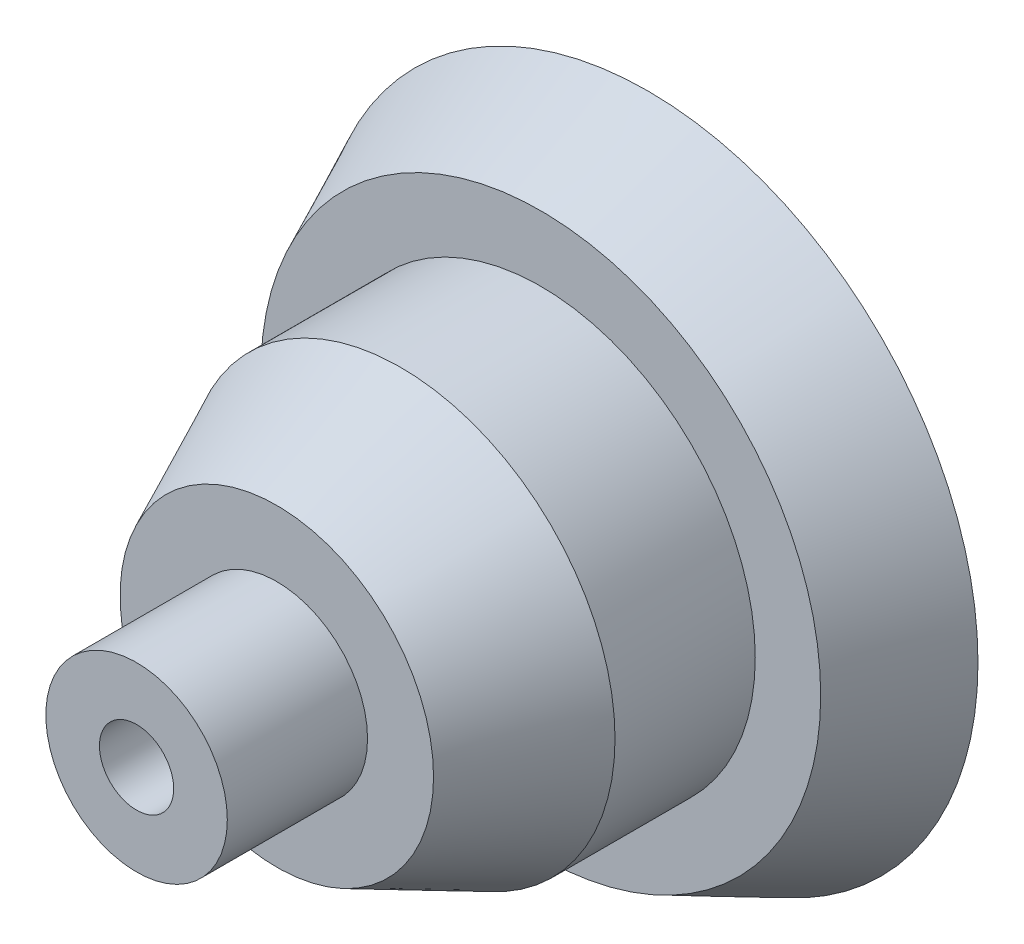
ISO-10303-21;
HEADER;
FILE_DESCRIPTION(('STEP AP214'),'2;1');
FILE_NAME('part.step','',(''),(''),'','','');
FILE_SCHEMA(('AUTOMOTIVE_DESIGN { 1 0 10303 214 1 1 1 1 }'));
ENDSEC;
DATA;
#1=APPLICATION_CONTEXT('core data for automotive mechanical design processes');
#2=APPLICATION_PROTOCOL_DEFINITION('international standard','automotive_design',2000,#1);
#3=PRODUCT_CONTEXT('',#1,'mechanical');
#4=PRODUCT('Part','Part','',(#3));
#5=PRODUCT_RELATED_PRODUCT_CATEGORY('part','',(#4));
#6=PRODUCT_DEFINITION_FORMATION('','',#4);
#7=PRODUCT_DEFINITION_CONTEXT('part definition',#1,'design');
#8=PRODUCT_DEFINITION('design','',#6,#7);
#9=PRODUCT_DEFINITION_SHAPE('','',#8);
#10=(LENGTH_UNIT() NAMED_UNIT(*) SI_UNIT(.MILLI.,.METRE.));
#11=(NAMED_UNIT(*) PLANE_ANGLE_UNIT() SI_UNIT($,.RADIAN.));
#12=(NAMED_UNIT(*) SI_UNIT($,.STERADIAN.) SOLID_ANGLE_UNIT());
#13=UNCERTAINTY_MEASURE_WITH_UNIT(LENGTH_MEASURE(1.E-05),#10,'distance_accuracy_value','');
#14=(GEOMETRIC_REPRESENTATION_CONTEXT(3) GLOBAL_UNCERTAINTY_ASSIGNED_CONTEXT((#13)) GLOBAL_UNIT_ASSIGNED_CONTEXT((#10,
#11,#12)) REPRESENTATION_CONTEXT('',''));
#15=CARTESIAN_POINT('',(0.,0.,0.));
#16=DIRECTION('',(0.,0.,1.));
#17=DIRECTION('',(1.,0.,0.));
#18=AXIS2_PLACEMENT_3D('',#15,#16,#17);
#19=CARTESIAN_POINT('',(0.,0.,50.));
#20=DIRECTION('',(0.,0.,1.));
#21=DIRECTION('',(1.,0.,0.));
#22=AXIS2_PLACEMENT_3D('',#19,#20,#21);
#23=CYLINDRICAL_SURFACE('',#22,4.49999999999999);
#24=CARTESIAN_POINT('',(0.,0.,16.5));
#25=DIRECTION('',(0.,0.,1.));
#26=DIRECTION('',(1.,0.,0.));
#27=AXIS2_PLACEMENT_3D('',#24,#25,#26);
#28=CIRCLE('',#27,4.49999999999999);
#29=CARTESIAN_POINT('',(4.49999999999999,0.,16.5));
#30=VERTEX_POINT('',#29);
#31=EDGE_CURVE('E74',#30,#30,#28,.T.);
#32=ORIENTED_EDGE('',*,*,#31,.F.);
#33=EDGE_LOOP('',(#32));
#34=FACE_BOUND('',#33,.T.);
#35=CARTESIAN_POINT('',(0.,0.,38.5));
#36=DIRECTION('',(0.,0.,1.));
#37=DIRECTION('',(1.,0.,0.));
#38=AXIS2_PLACEMENT_3D('',#35,#36,#37);
#39=CIRCLE('',#38,4.49999999999999);
#40=CARTESIAN_POINT('',(4.49999999999999,0.,38.5));
#41=VERTEX_POINT('',#40);
#42=EDGE_CURVE('E10',#41,#41,#39,.T.);
#43=ORIENTED_EDGE('',*,*,#42,.T.);
#44=EDGE_LOOP('',(#43));
#45=FACE_BOUND('',#44,.T.);
#46=ADVANCED_FACE('F31',(#34,#45),#23,.F.);
#47=CARTESIAN_POINT('',(0.,4.49999999999999,38.5));
#48=DIRECTION('',(0.,0.,-1.));
#49=DIRECTION('',(-1.,0.,0.));
#50=AXIS2_PLACEMENT_3D('',#47,#48,#49);
#51=PLANE('',#50);
#52=ORIENTED_EDGE('',*,*,#42,.F.);
#53=EDGE_LOOP('',(#52));
#54=FACE_BOUND('',#53,.T.);
#55=CARTESIAN_POINT('',(0.,0.,38.5));
#56=DIRECTION('',(0.,0.,1.));
#57=DIRECTION('',(1.,0.,0.));
#58=AXIS2_PLACEMENT_3D('',#55,#56,#57);
#59=CIRCLE('',#58,11.);
#60=CARTESIAN_POINT('',(11.,0.,38.5));
#61=VERTEX_POINT('',#60);
#62=EDGE_CURVE('E37',#61,#61,#59,.T.);
#63=ORIENTED_EDGE('',*,*,#62,.T.);
#64=EDGE_LOOP('',(#63));
#65=FACE_BOUND('',#64,.T.);
#66=ADVANCED_FACE('F81',(#54,#65),#51,.F.);
#67=CARTESIAN_POINT('',(0.,0.,50.));
#68=DIRECTION('',(0.,0.,1.));
#69=DIRECTION('',(1.,0.,0.));
#70=AXIS2_PLACEMENT_3D('',#67,#68,#69);
#71=CYLINDRICAL_SURFACE('',#70,11.);
#72=ORIENTED_EDGE('',*,*,#62,.F.);
#73=EDGE_LOOP('',(#72));
#74=FACE_BOUND('',#73,.T.);
#75=CARTESIAN_POINT('',(0.,0.,21.5));
#76=DIRECTION('',(0.,0.,1.));
#77=DIRECTION('',(1.,0.,0.));
#78=AXIS2_PLACEMENT_3D('',#75,#76,#77);
#79=CIRCLE('',#78,11.);
#80=CARTESIAN_POINT('',(11.,0.,21.5));
#81=VERTEX_POINT('',#80);
#82=EDGE_CURVE('E41',#81,#81,#79,.T.);
#83=ORIENTED_EDGE('',*,*,#82,.T.);
#84=EDGE_LOOP('',(#83));
#85=FACE_BOUND('',#84,.T.);
#86=ADVANCED_FACE('F85',(#74,#85),#71,.T.);
#87=CARTESIAN_POINT('',(0.,11.,21.5));
#88=DIRECTION('',(0.,0.,-1.));
#89=DIRECTION('',(-1.,0.,0.));
#90=AXIS2_PLACEMENT_3D('',#87,#88,#89);
#91=PLANE('',#90);
#92=ORIENTED_EDGE('',*,*,#82,.F.);
#93=EDGE_LOOP('',(#92));
#94=FACE_BOUND('',#93,.T.);
#95=CARTESIAN_POINT('',(0.,0.,21.5));
#96=DIRECTION('',(0.,0.,1.));
#97=DIRECTION('',(1.,0.,0.));
#98=AXIS2_PLACEMENT_3D('',#95,#96,#97);
#99=CIRCLE('',#98,19.);
#100=CARTESIAN_POINT('',(19.,0.,21.5));
#101=VERTEX_POINT('',#100);
#102=EDGE_CURVE('E45',#101,#101,#99,.T.);
#103=ORIENTED_EDGE('',*,*,#102,.T.);
#104=EDGE_LOOP('',(#103));
#105=FACE_BOUND('',#104,.T.);
#106=ADVANCED_FACE('F90',(#94,#105),#91,.F.);
#107=CARTESIAN_POINT('',(0.,0.,6.5));
#108=DIRECTION('',(0.,0.,-1.));
#109=DIRECTION('',(-1.,0.,0.));
#110=AXIS2_PLACEMENT_3D('',#107,#108,#109);
#111=CONICAL_SURFACE('',#110,26.,0.436627159813541);
#112=ORIENTED_EDGE('',*,*,#102,.F.);
#113=EDGE_LOOP('',(#112));
#114=FACE_BOUND('',#113,.T.);
#115=CARTESIAN_POINT('',(0.,0.,6.5));
#116=DIRECTION('',(0.,0.,1.));
#117=DIRECTION('',(1.,0.,0.));
#118=AXIS2_PLACEMENT_3D('',#115,#116,#117);
#119=CIRCLE('',#118,26.);
#120=CARTESIAN_POINT('',(26.,0.,6.5));
#121=VERTEX_POINT('',#120);
#122=EDGE_CURVE('E50',#121,#121,#119,.T.);
#123=ORIENTED_EDGE('',*,*,#122,.T.);
#124=EDGE_LOOP('',(#123));
#125=FACE_BOUND('',#124,.T.);
#126=ADVANCED_FACE('F96',(#114,#125),#111,.T.);
#127=CARTESIAN_POINT('',(0.,0.,50.));
#128=DIRECTION('',(0.,0.,1.));
#129=DIRECTION('',(1.,0.,0.));
#130=AXIS2_PLACEMENT_3D('',#127,#128,#129);
#131=CYLINDRICAL_SURFACE('',#130,26.);
#132=ORIENTED_EDGE('',*,*,#122,.F.);
#133=EDGE_LOOP('',(#132));
#134=FACE_BOUND('',#133,.T.);
#135=CARTESIAN_POINT('',(0.,0.,-10.5));
#136=DIRECTION('',(0.,0.,1.));
#137=DIRECTION('',(1.,0.,0.));
#138=AXIS2_PLACEMENT_3D('',#135,#136,#137);
#139=CIRCLE('',#138,26.);
#140=CARTESIAN_POINT('',(26.,0.,-10.5));
#141=VERTEX_POINT('',#140);
#142=EDGE_CURVE('E53',#141,#141,#139,.T.);
#143=ORIENTED_EDGE('',*,*,#142,.T.);
#144=EDGE_LOOP('',(#143));
#145=FACE_BOUND('',#144,.T.);
#146=ADVANCED_FACE('F100',(#134,#145),#131,.T.);
#147=CARTESIAN_POINT('',(0.,26.,-10.5));
#148=DIRECTION('',(0.,0.,-1.));
#149=DIRECTION('',(-1.,0.,0.));
#150=AXIS2_PLACEMENT_3D('',#147,#148,#149);
#151=PLANE('',#150);
#152=ORIENTED_EDGE('',*,*,#142,.F.);
#153=EDGE_LOOP('',(#152));
#154=FACE_BOUND('',#153,.T.);
#155=CARTESIAN_POINT('',(0.,0.,-10.5));
#156=DIRECTION('',(0.,0.,1.));
#157=DIRECTION('',(1.,0.,0.));
#158=AXIS2_PLACEMENT_3D('',#155,#156,#157);
#159=CIRCLE('',#158,33.9324749640395);
#160=CARTESIAN_POINT('',(33.9324749640395,0.,-10.5));
#161=VERTEX_POINT('',#160);
#162=EDGE_CURVE('E56',#161,#161,#159,.T.);
#163=ORIENTED_EDGE('',*,*,#162,.T.);
#164=EDGE_LOOP('',(#163));
#165=FACE_BOUND('',#164,.T.);
#166=ADVANCED_FACE('F104',(#154,#165),#151,.F.);
#167=CARTESIAN_POINT('',(0.,0.,-23.5));
#168=DIRECTION('',(0.,0.,-1.));
#169=DIRECTION('',(-1.,0.,0.));
#170=AXIS2_PLACEMENT_3D('',#167,#168,#169);
#171=CONICAL_SURFACE('',#170,40.,0.436681378848979);
#172=ORIENTED_EDGE('',*,*,#162,.F.);
#173=EDGE_LOOP('',(#172));
#174=FACE_BOUND('',#173,.T.);
#175=CARTESIAN_POINT('',(0.,0.,-23.5));
#176=DIRECTION('',(0.,0.,1.));
#177=DIRECTION('',(1.,0.,0.));
#178=AXIS2_PLACEMENT_3D('',#175,#176,#177);
#179=CIRCLE('',#178,40.);
#180=CARTESIAN_POINT('',(40.,0.,-23.5));
#181=VERTEX_POINT('',#180);
#182=EDGE_CURVE('E59',#181,#181,#179,.T.);
#183=ORIENTED_EDGE('',*,*,#182,.T.);
#184=EDGE_LOOP('',(#183));
#185=FACE_BOUND('',#184,.T.);
#186=ADVANCED_FACE('F108',(#174,#185),#171,.T.);
#187=CARTESIAN_POINT('',(0.,40.,-23.5));
#188=DIRECTION('',(0.,0.,1.));
#189=DIRECTION('',(1.,0.,0.));
#190=AXIS2_PLACEMENT_3D('',#187,#188,#189);
#191=PLANE('',#190);
#192=ORIENTED_EDGE('',*,*,#182,.F.);
#193=EDGE_LOOP('',(#192));
#194=FACE_BOUND('',#193,.T.);
#195=CARTESIAN_POINT('',(0.,0.,-23.5));
#196=DIRECTION('',(0.,0.,1.));
#197=DIRECTION('',(1.,0.,0.));
#198=AXIS2_PLACEMENT_3D('',#195,#196,#197);
#199=CIRCLE('',#198,4.5);
#200=CARTESIAN_POINT('',(4.5,0.,-23.5));
#201=VERTEX_POINT('',#200);
#202=EDGE_CURVE('E62',#201,#201,#199,.T.);
#203=ORIENTED_EDGE('',*,*,#202,.T.);
#204=EDGE_LOOP('',(#203));
#205=FACE_BOUND('',#204,.T.);
#206=ADVANCED_FACE('F112',(#194,#205),#191,.F.);
#207=CARTESIAN_POINT('',(0.,0.,50.));
#208=DIRECTION('',(0.,0.,1.));
#209=DIRECTION('',(1.,0.,0.));
#210=AXIS2_PLACEMENT_3D('',#207,#208,#209);
#211=CYLINDRICAL_SURFACE('',#210,4.5);
#212=ORIENTED_EDGE('',*,*,#202,.F.);
#213=EDGE_LOOP('',(#212));
#214=FACE_BOUND('',#213,.T.);
#215=CARTESIAN_POINT('',(0.,0.,-16.5));
#216=DIRECTION('',(0.,0.,1.));
#217=DIRECTION('',(1.,0.,0.));
#218=AXIS2_PLACEMENT_3D('',#215,#216,#217);
#219=CIRCLE('',#218,4.49999999999999);
#220=CARTESIAN_POINT('',(4.49999999999999,0.,-16.5));
#221=VERTEX_POINT('',#220);
#222=EDGE_CURVE('E65',#221,#221,#219,.T.);
#223=ORIENTED_EDGE('',*,*,#222,.T.);
#224=EDGE_LOOP('',(#223));
#225=FACE_BOUND('',#224,.T.);
#226=ADVANCED_FACE('F116',(#214,#225),#211,.F.);
#227=CARTESIAN_POINT('',(0.,4.49999999999999,-16.5));
#228=DIRECTION('',(0.,0.,-1.));
#229=DIRECTION('',(-1.,0.,0.));
#230=AXIS2_PLACEMENT_3D('',#227,#228,#229);
#231=PLANE('',#230);
#232=ORIENTED_EDGE('',*,*,#222,.F.);
#233=EDGE_LOOP('',(#232));
#234=FACE_BOUND('',#233,.T.);
#235=CARTESIAN_POINT('',(0.,0.,-16.5));
#236=DIRECTION('',(0.,0.,1.));
#237=DIRECTION('',(1.,0.,0.));
#238=AXIS2_PLACEMENT_3D('',#235,#236,#237);
#239=CIRCLE('',#238,11.);
#240=CARTESIAN_POINT('',(11.,0.,-16.5));
#241=VERTEX_POINT('',#240);
#242=EDGE_CURVE('E68',#241,#241,#239,.T.);
#243=ORIENTED_EDGE('',*,*,#242,.T.);
#244=EDGE_LOOP('',(#243));
#245=FACE_BOUND('',#244,.T.);
#246=ADVANCED_FACE('F120',(#234,#245),#231,.F.);
#247=CARTESIAN_POINT('',(0.,0.,50.));
#248=DIRECTION('',(0.,0.,1.));
#249=DIRECTION('',(1.,0.,0.));
#250=AXIS2_PLACEMENT_3D('',#247,#248,#249);
#251=CYLINDRICAL_SURFACE('',#250,11.);
#252=ORIENTED_EDGE('',*,*,#242,.F.);
#253=EDGE_LOOP('',(#252));
#254=FACE_BOUND('',#253,.T.);
#255=CARTESIAN_POINT('',(0.,0.,16.5));
#256=DIRECTION('',(0.,0.,1.));
#257=DIRECTION('',(1.,0.,0.));
#258=AXIS2_PLACEMENT_3D('',#255,#256,#257);
#259=CIRCLE('',#258,11.);
#260=CARTESIAN_POINT('',(11.,0.,16.5));
#261=VERTEX_POINT('',#260);
#262=EDGE_CURVE('E71',#261,#261,#259,.T.);
#263=ORIENTED_EDGE('',*,*,#262,.T.);
#264=EDGE_LOOP('',(#263));
#265=FACE_BOUND('',#264,.T.);
#266=ADVANCED_FACE('F124',(#254,#265),#251,.F.);
#267=CARTESIAN_POINT('',(0.,11.,16.5));
#268=DIRECTION('',(0.,0.,1.));
#269=DIRECTION('',(1.,0.,0.));
#270=AXIS2_PLACEMENT_3D('',#267,#268,#269);
#271=PLANE('',#270);
#272=ORIENTED_EDGE('',*,*,#262,.F.);
#273=EDGE_LOOP('',(#272));
#274=FACE_BOUND('',#273,.T.);
#275=ORIENTED_EDGE('',*,*,#31,.T.);
#276=EDGE_LOOP('',(#275));
#277=FACE_BOUND('',#276,.T.);
#278=ADVANCED_FACE('F78',(#274,#277),#271,.F.);
#279=CLOSED_SHELL('',(#46,#66,#86,#106,#126,#146,#166,#186,#206,#226,#246,#266,#278));
#280=MANIFOLD_SOLID_BREP('B2',#279);
#281=ADVANCED_BREP_SHAPE_REPRESENTATION('',(#18,#280),#14);
#282=SHAPE_DEFINITION_REPRESENTATION(#9,#281);
ENDSEC;
END-ISO-10303-21;
